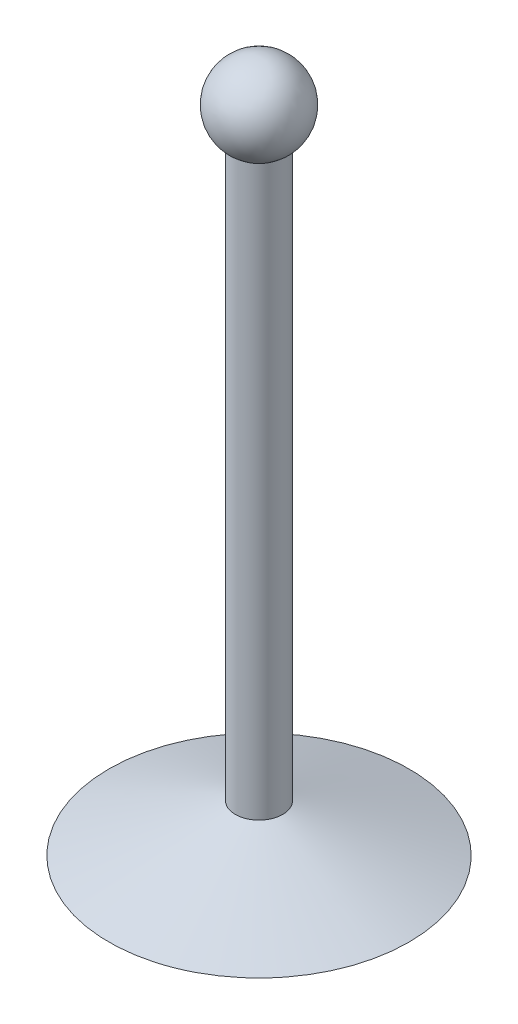
ISO-10303-21;
HEADER;
FILE_DESCRIPTION(('STEP AP214'),'2;1');
FILE_NAME('part.step','',(''),(''),'','','');
FILE_SCHEMA(('AUTOMOTIVE_DESIGN { 1 0 10303 214 1 1 1 1 }'));
ENDSEC;
DATA;
#1=APPLICATION_CONTEXT('core data for automotive mechanical design processes');
#2=APPLICATION_PROTOCOL_DEFINITION('international standard','automotive_design',2000,#1);
#3=PRODUCT_CONTEXT('',#1,'mechanical');
#4=PRODUCT('Part','Part','',(#3));
#5=PRODUCT_RELATED_PRODUCT_CATEGORY('part','',(#4));
#6=PRODUCT_DEFINITION_FORMATION('','',#4);
#7=PRODUCT_DEFINITION_CONTEXT('part definition',#1,'design');
#8=PRODUCT_DEFINITION('design','',#6,#7);
#9=PRODUCT_DEFINITION_SHAPE('','',#8);
#10=(LENGTH_UNIT() NAMED_UNIT(*) SI_UNIT(.MILLI.,.METRE.));
#11=(NAMED_UNIT(*) PLANE_ANGLE_UNIT() SI_UNIT($,.RADIAN.));
#12=(NAMED_UNIT(*) SI_UNIT($,.STERADIAN.) SOLID_ANGLE_UNIT());
#13=UNCERTAINTY_MEASURE_WITH_UNIT(LENGTH_MEASURE(1.E-05),#10,'distance_accuracy_value','');
#14=(GEOMETRIC_REPRESENTATION_CONTEXT(3) GLOBAL_UNCERTAINTY_ASSIGNED_CONTEXT((#13)) GLOBAL_UNIT_ASSIGNED_CONTEXT((#10,
#11,#12)) REPRESENTATION_CONTEXT('',''));
#15=CARTESIAN_POINT('',(0.,0.,0.));
#16=DIRECTION('',(0.,0.,1.));
#17=DIRECTION('',(1.,0.,0.));
#18=AXIS2_PLACEMENT_3D('',#15,#16,#17);
#19=CARTESIAN_POINT('',(0.,-10.,0.));
#20=DIRECTION('',(0.,-1.,0.));
#21=DIRECTION('',(0.,0.,-1.));
#22=AXIS2_PLACEMENT_3D('',#19,#20,#21);
#23=PLANE('',#22);
#24=CARTESIAN_POINT('',(0.,-10.,0.));
#25=DIRECTION('',(0.,-1.,0.));
#26=DIRECTION('',(0.,0.,-1.));
#27=AXIS2_PLACEMENT_3D('',#24,#25,#26);
#28=CIRCLE('',#27,31.6722447725466);
#29=CARTESIAN_POINT('',(-17.6870566892043,-10.,-26.2735440054245));
#30=VERTEX_POINT('',#29);
#31=EDGE_CURVE('E46',#30,#30,#28,.T.);
#32=ORIENTED_EDGE('',*,*,#31,.T.);
#33=EDGE_LOOP('',(#32));
#34=FACE_BOUND('',#33,.T.);
#35=ADVANCED_FACE('F39',(#34),#23,.T.);
#36=CARTESIAN_POINT('',(-17.6870566892043,-10.,-26.2735440054245));
#37=CARTESIAN_POINT('',(-1.2677767746817,0.,-4.83660439250283));
#38=CARTESIAN_POINT('',(-70.2341447000534,-10.,9.10056937298411));
#39=CARTESIAN_POINT('',(-10.9409855596874,0.,-2.30105084313943));
#40=CARTESIAN_POINT('',(-34.8600313216447,-10.,61.6476573838332));
#41=CARTESIAN_POINT('',(-8.40543201032395,0.,7.37215794186623));
#42=CARTESIAN_POINT('',(17.6870566892043,-10.,26.2735440054245));
#43=CARTESIAN_POINT('',(1.2677767746817,0.,4.83660439250283));
#44=CARTESIAN_POINT('',(70.2341447000535,-10.,-9.10056937298415));
#45=CARTESIAN_POINT('',(10.9409855596874,0.,2.30105084313943));
#46=CARTESIAN_POINT('',(34.8600313216447,-10.,-61.6476573838332));
#47=CARTESIAN_POINT('',(8.40543201032396,0.,-7.37215794186623));
#48=CARTESIAN_POINT('',(-17.6870566892043,-10.,-26.2735440054245));
#49=CARTESIAN_POINT('',(-1.2677767746817,0.,-4.83660439250283));
#50=(BOUNDED_SURFACE() B_SPLINE_SURFACE(3,1,((#36,#37),(#38,#39),(#40,#41),(#42,#43),(#44,#45),
(#46,#47),(#48,#49)),.UNSPECIFIED.,.T.,.F.,.F.) B_SPLINE_SURFACE_WITH_KNOTS((4,3,4),(2,2),(0.,
0.5,1.),(0.,1.),.UNSPECIFIED.) GEOMETRIC_REPRESENTATION_ITEM() RATIONAL_B_SPLINE_SURFACE(((1.,
1.),(0.333333333333333,0.333333333333334),(0.333333333333333,0.333333333333334),(1.,1.),
(0.333333333333333,0.333333333333333),(0.333333333333333,0.333333333333333),(1.,1.))) REPRESENTATION_ITEM('') SURFACE());
#51=CARTESIAN_POINT('',(0.,0.,0.));
#52=DIRECTION('',(0.,-1.,0.));
#53=DIRECTION('',(0.,0.,1.));
#54=AXIS2_PLACEMENT_3D('',#51,#52,#53);
#55=CIRCLE('',#54,5.);
#56=CARTESIAN_POINT('',(-1.2677767746817,0.,-4.83660439250283));
#57=VERTEX_POINT('',#56);
#58=EDGE_CURVE('E50',#57,#57,#55,.T.);
#59=CARTESIAN_POINT('',(-17.6870566892043,-10.,-26.2735440054245));
#60=CARTESIAN_POINT('',(-17.5160225234281,-9.89583333333333,-26.0502425511233));
#61=CARTESIAN_POINT('',(-17.3449883576518,-9.79166666666667,-25.826941096822));
#62=CARTESIAN_POINT('',(-17.0029200260992,-9.58333333333333,-25.3803381882195));
#63=CARTESIAN_POINT('',(-16.8318858603229,-9.47916666666667,-25.1570367339182));
#64=CARTESIAN_POINT('',(-16.4898175287704,-9.27083333333333,-24.7104338253157));
#65=CARTESIAN_POINT('',(-16.3187833629941,-9.16666666666667,-24.4871323710144));
#66=CARTESIAN_POINT('',(-15.9767150314416,-8.95833333333333,-24.0405294624119));
#67=CARTESIAN_POINT('',(-15.8056808656653,-8.85416666666667,-23.8172280081106));
#68=CARTESIAN_POINT('',(-15.4636125341127,-8.64583333333333,-23.3706250995081));
#69=CARTESIAN_POINT('',(-15.2925783683364,-8.54166666666667,-23.1473236452068));
#70=CARTESIAN_POINT('',(-14.9505100367839,-8.33333333333333,-22.7007207366042));
#71=CARTESIAN_POINT('',(-14.7794758710076,-8.22916666666667,-22.477419282303));
#72=CARTESIAN_POINT('',(-14.4374075394551,-8.02083333333333,-22.0308163737004));
#73=CARTESIAN_POINT('',(-14.2663733736788,-7.91666666666667,-21.8075149193992));
#74=CARTESIAN_POINT('',(-13.9243050421262,-7.70833333333333,-21.3609120107966));
#75=CARTESIAN_POINT('',(-13.75327087635,-7.60416666666667,-21.1376105564954));
#76=CARTESIAN_POINT('',(-13.4112025447974,-7.39583333333333,-20.6910076478928));
#77=CARTESIAN_POINT('',(-13.2401683790211,-7.29166666666667,-20.4677061935916));
#78=CARTESIAN_POINT('',(-12.8981000474686,-7.08333333333333,-20.021103284989));
#79=CARTESIAN_POINT('',(-12.7270658816923,-6.97916666666667,-19.7978018306878));
#80=CARTESIAN_POINT('',(-12.3849975501397,-6.77083333333333,-19.3511989220852));
#81=CARTESIAN_POINT('',(-12.2139633843635,-6.66666666666667,-19.127897467784));
#82=CARTESIAN_POINT('',(-11.8718950528109,-6.45833333333333,-18.6812945591814));
#83=CARTESIAN_POINT('',(-11.7008608870346,-6.35416666666667,-18.4579931048802));
#84=CARTESIAN_POINT('',(-11.3587925554821,-6.14583333333333,-18.0113901962776));
#85=CARTESIAN_POINT('',(-11.1877583897058,-6.04166666666667,-17.7880887419764));
#86=CARTESIAN_POINT('',(-10.8456900581532,-5.83333333333333,-17.3414858333738));
#87=CARTESIAN_POINT('',(-10.674655892377,-5.72916666666667,-17.1181843790726));
#88=CARTESIAN_POINT('',(-10.3325875608244,-5.52083333333333,-16.67158147047));
#89=CARTESIAN_POINT('',(-10.1615533950481,-5.41666666666667,-16.4482800161688));
#90=CARTESIAN_POINT('',(-9.81948506349557,-5.20833333333333,-16.0016771075662));
#91=CARTESIAN_POINT('',(-9.64845089771929,-5.10416666666667,-15.778375653265));
#92=CARTESIAN_POINT('',(-9.30638256616674,-4.89583333333333,-15.3317727446624));
#93=CARTESIAN_POINT('',(-9.13534840039046,-4.79166666666667,-15.1084712903611));
#94=CARTESIAN_POINT('',(-8.79328006883791,-4.58333333333333,-14.6618683817586));
#95=CARTESIAN_POINT('',(-8.62224590306163,-4.47916666666667,-14.4385669274573));
#96=CARTESIAN_POINT('',(-8.28017757150907,-4.27083333333333,-13.9919640188548));
#97=CARTESIAN_POINT('',(-8.1091434057328,-4.16666666666667,-13.7686625645535));
#98=CARTESIAN_POINT('',(-7.76707507418024,-3.95833333333333,-13.322059655951));
#99=CARTESIAN_POINT('',(-7.59604090840396,-3.85416666666667,-13.0987582016497));
#100=CARTESIAN_POINT('',(-7.25397257685141,-3.64583333333333,-12.6521552930472));
#101=CARTESIAN_POINT('',(-7.08293841107513,-3.54166666666667,-12.4288538387459));
#102=CARTESIAN_POINT('',(-6.74087007952258,-3.33333333333333,-11.9822509301434));
#103=CARTESIAN_POINT('',(-6.5698359137463,-3.22916666666667,-11.7589494758421));
#104=CARTESIAN_POINT('',(-6.22776758219375,-3.02083333333333,-11.3123465672396));
#105=CARTESIAN_POINT('',(-6.05673341641747,-2.91666666666667,-11.0890451129383));
#106=CARTESIAN_POINT('',(-5.71466508486491,-2.70833333333333,-10.6424422043358));
#107=CARTESIAN_POINT('',(-5.54363091908864,-2.60416666666667,-10.4191407500345));
#108=CARTESIAN_POINT('',(-5.20156258753608,-2.39583333333333,-9.97253784143199));
#109=CARTESIAN_POINT('',(-5.0305284217598,-2.29166666666667,-9.74923638713072));
#110=CARTESIAN_POINT('',(-4.68846009020725,-2.08333333333333,-9.30263347852818));
#111=CARTESIAN_POINT('',(-4.51742592443097,-1.97916666666667,-9.07933202422692));
#112=CARTESIAN_POINT('',(-4.17535759287842,-1.77083333333333,-8.63272911562438));
#113=CARTESIAN_POINT('',(-4.00432342710214,-1.66666666666667,-8.40942766132311));
#114=CARTESIAN_POINT('',(-3.66225509554959,-1.45833333333333,-7.96282475272058));
#115=CARTESIAN_POINT('',(-3.49122092977331,-1.35416666666667,-7.73952329841931));
#116=CARTESIAN_POINT('',(-3.14915259822075,-1.14583333333333,-7.29292038981677));
#117=CARTESIAN_POINT('',(-2.97811843244448,-1.04166666666667,-7.06961893551551));
#118=CARTESIAN_POINT('',(-2.63605010089192,-0.833333333333333,-6.62301602691297));
#119=CARTESIAN_POINT('',(-2.46501593511564,-0.729166666666667,-6.3997145726117));
#120=CARTESIAN_POINT('',(-2.12294760356309,-0.520833333333333,-5.95311166400917));
#121=CARTESIAN_POINT('',(-1.95191343778681,-0.416666666666667,-5.7298102097079));
#122=CARTESIAN_POINT('',(-1.60984510623426,-0.208333333333333,-5.28320730110537));
#123=CARTESIAN_POINT('',(-1.43881094045798,-0.104166666666667,-5.0599058468041));
#124=CARTESIAN_POINT('',(-1.2677767746817,0.,-4.83660439250283));
#125=B_SPLINE_CURVE_WITH_KNOTS('',3,(#59,#60,#61,#62,#63,#64,#65,#66,#67,#68,#69,#70,#71,#72,
#73,#74,#75,#76,#77,#78,#79,#80,#81,#82,#83,#84,#85,#86,#87,#88,#89,#90,#91,#92,#93,#94,#95,#96,
#97,#98,#99,#100,#101,#102,#103,#104,#105,#106,#107,#108,#109,#110,#111,#112,#113,#114,#115,
#116,#117,#118,#119,#120,#121,#122,#123,#124),.UNSPECIFIED.,.F.,.F.,(4,2,2,2,2,2,2,2,2,2,2,2,2,
2,2,2,2,2,2,2,2,2,2,2,2,2,2,2,2,2,2,2,4),(0.,0.899834583800067,1.79966916760013,2.6995037514002,
3.59933833520026,4.49917291900032,5.39900750280038,6.29884208660045,7.19867667040051,
8.09851125420058,8.99834583800064,9.89818042180071,10.7980150056008,11.6978495894008,
12.5976841732009,13.497518757001,14.397353340801,15.2971879246011,16.1970225084012,
17.0968570922012,17.9966916760013,18.8965262598013,19.7963608436014,20.6961954274015,
21.5960300112015,22.4958645950016,23.3956991788017,24.2955337626017,25.1953683464018,
26.0952029302018,26.9950375140019,27.894872097802,28.794706681602),.UNSPECIFIED.);
#126=EDGE_CURVE('BSEAM70',#30,#57,#125,.T.);
#127=ORIENTED_EDGE('',*,*,#31,.F.);
#128=ORIENTED_EDGE('',*,*,#58,.T.);
#129=ORIENTED_EDGE('',*,*,#126,.T.);
#130=ORIENTED_EDGE('',*,*,#126,.F.);
#131=EDGE_LOOP('',(#127,#129,#128,#130));
#132=FACE_BOUND('',#131,.T.);
#133=ADVANCED_FACE('F70',(#132),#50,.T.);
#134=CARTESIAN_POINT('',(0.,120.,0.));
#135=DIRECTION('',(0.,-1.,0.));
#136=DIRECTION('',(0.,0.,-1.));
#137=AXIS2_PLACEMENT_3D('',#134,#135,#136);
#138=CYLINDRICAL_SURFACE('',#137,5.);
#139=CARTESIAN_POINT('',(0.,120.,0.));
#140=DIRECTION('',(0.,1.,0.));
#141=DIRECTION('',(0.,0.,1.));
#142=AXIS2_PLACEMENT_3D('',#139,#140,#141);
#143=CIRCLE('',#142,5.);
#144=CARTESIAN_POINT('',(0.,120.,5.));
#145=VERTEX_POINT('',#144);
#146=EDGE_CURVE('E11',#145,#145,#143,.T.);
#147=ORIENTED_EDGE('',*,*,#146,.F.);
#148=EDGE_LOOP('',(#147));
#149=FACE_BOUND('',#148,.T.);
#150=ORIENTED_EDGE('',*,*,#58,.F.);
#151=EDGE_LOOP('',(#150));
#152=FACE_BOUND('',#151,.T.);
#153=ADVANCED_FACE('F75',(#149,#152),#138,.T.);
#154=CARTESIAN_POINT('',(0.,127.21875,0.));
#155=DIRECTION('',(0.,0.,1.));
#156=DIRECTION('',(1.,0.,0.));
#157=AXIS2_PLACEMENT_3D('',#154,#155,#156);
#158=SPHERICAL_SURFACE('',#157,8.78125000000001);
#159=CARTESIAN_POINT('',(0.,127.21875,0.));
#160=DIRECTION('',(0.,1.,0.));
#161=DIRECTION('',(0.,0.,1.));
#162=AXIS2_PLACEMENT_3D('',#159,#160,#161);
#163=SPHERICAL_SURFACE('',#162,8.78125000000001);
#164=ORIENTED_EDGE('',*,*,#146,.T.);
#165=EDGE_LOOP('',(#164));
#166=FACE_BOUND('',#165,.T.);
#167=ADVANCED_FACE('F41',(#166),#163,.T.);
#168=CLOSED_SHELL('',(#35,#133,#153,#167));
#169=MANIFOLD_SOLID_BREP('B2',#168);
#170=ADVANCED_BREP_SHAPE_REPRESENTATION('',(#18,#169),#14);
#171=SHAPE_DEFINITION_REPRESENTATION(#9,#170);
ENDSEC;
END-ISO-10303-21;
